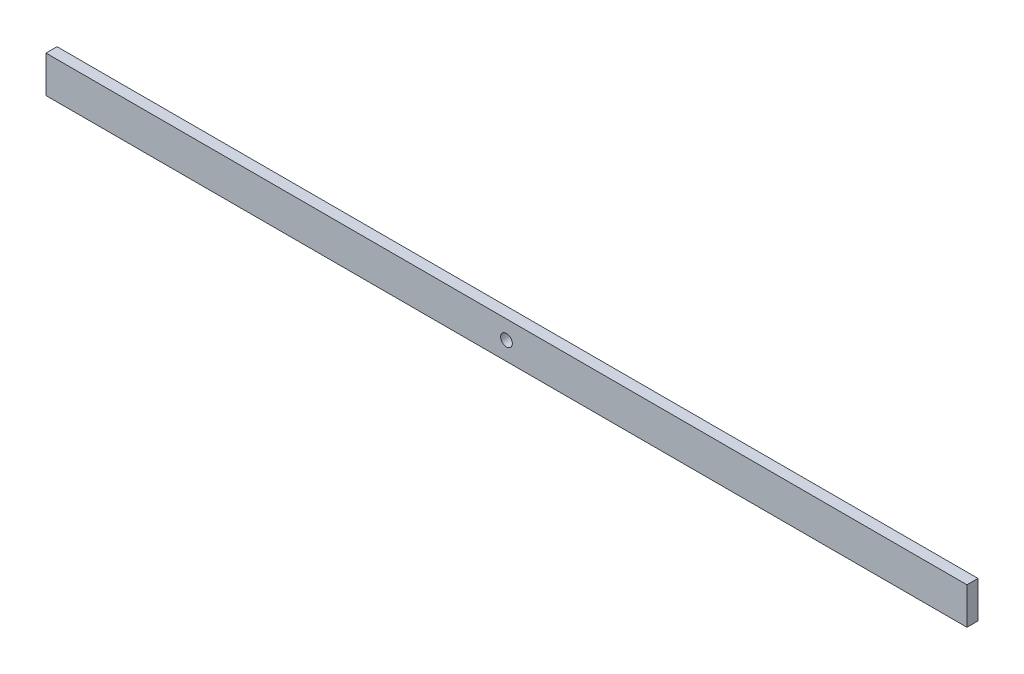
ISO-10303-21;
HEADER;
FILE_DESCRIPTION(('STEP AP214'),'2;1');
FILE_NAME('part.step','',(''),(''),'','','');
FILE_SCHEMA(('AUTOMOTIVE_DESIGN { 1 0 10303 214 1 1 1 1 }'));
ENDSEC;
DATA;
#1=APPLICATION_CONTEXT('core data for automotive mechanical design processes');
#2=APPLICATION_PROTOCOL_DEFINITION('international standard','automotive_design',2000,#1);
#3=PRODUCT_CONTEXT('',#1,'mechanical');
#4=PRODUCT('Part','Part','',(#3));
#5=PRODUCT_RELATED_PRODUCT_CATEGORY('part','',(#4));
#6=PRODUCT_DEFINITION_FORMATION('','',#4);
#7=PRODUCT_DEFINITION_CONTEXT('part definition',#1,'design');
#8=PRODUCT_DEFINITION('design','',#6,#7);
#9=PRODUCT_DEFINITION_SHAPE('','',#8);
#10=(LENGTH_UNIT() NAMED_UNIT(*) SI_UNIT(.MILLI.,.METRE.));
#11=(NAMED_UNIT(*) PLANE_ANGLE_UNIT() SI_UNIT($,.RADIAN.));
#12=(NAMED_UNIT(*) SI_UNIT($,.STERADIAN.) SOLID_ANGLE_UNIT());
#13=UNCERTAINTY_MEASURE_WITH_UNIT(LENGTH_MEASURE(1.E-05),#10,'distance_accuracy_value','');
#14=(GEOMETRIC_REPRESENTATION_CONTEXT(3) GLOBAL_UNCERTAINTY_ASSIGNED_CONTEXT((#13)) GLOBAL_UNIT_ASSIGNED_CONTEXT((#10,
#11,#12)) REPRESENTATION_CONTEXT('',''));
#15=CARTESIAN_POINT('',(0.,0.,0.));
#16=DIRECTION('',(0.,0.,1.));
#17=DIRECTION('',(1.,0.,0.));
#18=AXIS2_PLACEMENT_3D('',#15,#16,#17);
#19=CARTESIAN_POINT('',(0.,0.,3.));
#20=DIRECTION('',(0.,0.,1.));
#21=DIRECTION('',(1.,0.,0.));
#22=AXIS2_PLACEMENT_3D('',#19,#20,#21);
#23=PLANE('',#22);
#24=DIRECTION('',(0.,1.,0.));
#25=VECTOR('',#24,1.);
#26=CARTESIAN_POINT('',(125.,5.,3.));
#27=LINE('',#26,#25);
#28=CARTESIAN_POINT('',(125.,-5.,3.));
#29=VERTEX_POINT('',#28);
#30=CARTESIAN_POINT('',(125.,5.,3.));
#31=VERTEX_POINT('',#30);
#32=EDGE_CURVE('E85',#29,#31,#27,.T.);
#33=ORIENTED_EDGE('',*,*,#32,.T.);
#34=DIRECTION('',(-1.,0.,0.));
#35=VECTOR('',#34,1.);
#36=CARTESIAN_POINT('',(-125.,5.,3.));
#37=LINE('',#36,#35);
#38=CARTESIAN_POINT('',(-125.,5.,3.));
#39=VERTEX_POINT('',#38);
#40=EDGE_CURVE('E80',#31,#39,#37,.T.);
#41=ORIENTED_EDGE('',*,*,#40,.T.);
#42=DIRECTION('',(0.,-1.,0.));
#43=VECTOR('',#42,1.);
#44=CARTESIAN_POINT('',(-125.,5.,3.));
#45=LINE('',#44,#43);
#46=CARTESIAN_POINT('',(-125.,-5.,3.));
#47=VERTEX_POINT('',#46);
#48=EDGE_CURVE('E83',#39,#47,#45,.T.);
#49=ORIENTED_EDGE('',*,*,#48,.T.);
#50=DIRECTION('',(1.,0.,0.));
#51=VECTOR('',#50,1.);
#52=CARTESIAN_POINT('',(-125.,-5.,3.));
#53=LINE('',#52,#51);
#54=EDGE_CURVE('E50',#47,#29,#53,.T.);
#55=ORIENTED_EDGE('',*,*,#54,.T.);
#56=EDGE_LOOP('',(#33,#41,#49,#55));
#57=FACE_BOUND('',#56,.T.);
#58=CARTESIAN_POINT('',(0.,0.,3.));
#59=DIRECTION('',(0.,0.,1.));
#60=DIRECTION('',(1.,0.,0.));
#61=AXIS2_PLACEMENT_3D('',#58,#59,#60);
#62=CIRCLE('',#61,1.585);
#63=CARTESIAN_POINT('',(1.58499999999997,0.,3.));
#64=VERTEX_POINT('',#63);
#65=EDGE_CURVE('E100',#64,#64,#62,.T.);
#66=ORIENTED_EDGE('',*,*,#65,.F.);
#67=EDGE_LOOP('',(#66));
#68=FACE_BOUND('',#67,.T.);
#69=ADVANCED_FACE('F33',(#57,#68),#23,.T.);
#70=CARTESIAN_POINT('',(0.,0.,0.));
#71=DIRECTION('',(0.,0.,1.));
#72=DIRECTION('',(1.,0.,0.));
#73=AXIS2_PLACEMENT_3D('',#70,#71,#72);
#74=PLANE('',#73);
#75=DIRECTION('',(0.,1.,0.));
#76=VECTOR('',#75,1.);
#77=CARTESIAN_POINT('',(125.,5.,0.));
#78=LINE('',#77,#76);
#79=CARTESIAN_POINT('',(125.,-5.,0.));
#80=VERTEX_POINT('',#79);
#81=CARTESIAN_POINT('',(125.,5.,0.));
#82=VERTEX_POINT('',#81);
#83=EDGE_CURVE('E97',#80,#82,#78,.T.);
#84=ORIENTED_EDGE('',*,*,#83,.F.);
#85=DIRECTION('',(1.,0.,0.));
#86=VECTOR('',#85,1.);
#87=CARTESIAN_POINT('',(-125.,-5.,0.));
#88=LINE('',#87,#86);
#89=CARTESIAN_POINT('',(-125.,-5.,0.));
#90=VERTEX_POINT('',#89);
#91=EDGE_CURVE('E73',#90,#80,#88,.T.);
#92=ORIENTED_EDGE('',*,*,#91,.F.);
#93=DIRECTION('',(0.,-1.,0.));
#94=VECTOR('',#93,1.);
#95=CARTESIAN_POINT('',(-125.,5.,0.));
#96=LINE('',#95,#94);
#97=CARTESIAN_POINT('',(-125.,5.,0.));
#98=VERTEX_POINT('',#97);
#99=EDGE_CURVE('E67',#98,#90,#96,.T.);
#100=ORIENTED_EDGE('',*,*,#99,.F.);
#101=DIRECTION('',(-1.,0.,0.));
#102=VECTOR('',#101,1.);
#103=CARTESIAN_POINT('',(-125.,5.,0.));
#104=LINE('',#103,#102);
#105=EDGE_CURVE('E89',#82,#98,#104,.T.);
#106=ORIENTED_EDGE('',*,*,#105,.F.);
#107=EDGE_LOOP('',(#84,#92,#100,#106));
#108=FACE_BOUND('',#107,.T.);
#109=CARTESIAN_POINT('',(0.,0.,0.));
#110=DIRECTION('',(0.,0.,1.));
#111=DIRECTION('',(1.,0.,0.));
#112=AXIS2_PLACEMENT_3D('',#109,#110,#111);
#113=CIRCLE('',#112,1.585);
#114=CARTESIAN_POINT('',(1.58499999999997,0.,0.));
#115=VERTEX_POINT('',#114);
#116=EDGE_CURVE('E112',#115,#115,#113,.T.);
#117=ORIENTED_EDGE('',*,*,#116,.T.);
#118=EDGE_LOOP('',(#117));
#119=FACE_BOUND('',#118,.T.);
#120=ADVANCED_FACE('F108',(#108,#119),#74,.F.);
#121=CARTESIAN_POINT('',(125.,5.,3.));
#122=DIRECTION('',(-1.,0.,0.));
#123=DIRECTION('',(0.,0.,1.));
#124=AXIS2_PLACEMENT_3D('',#121,#122,#123);
#125=PLANE('',#124);
#126=ORIENTED_EDGE('',*,*,#83,.T.);
#127=DIRECTION('',(0.,0.,-1.));
#128=VECTOR('',#127,1.);
#129=CARTESIAN_POINT('',(125.,5.,3.));
#130=LINE('',#129,#128);
#131=EDGE_CURVE('E11',#31,#82,#130,.T.);
#132=ORIENTED_EDGE('',*,*,#131,.F.);
#133=ORIENTED_EDGE('',*,*,#32,.F.);
#134=DIRECTION('',(0.,0.,-1.));
#135=VECTOR('',#134,1.);
#136=CARTESIAN_POINT('',(125.,-5.,3.));
#137=LINE('',#136,#135);
#138=EDGE_CURVE('E93',#29,#80,#137,.T.);
#139=ORIENTED_EDGE('',*,*,#138,.T.);
#140=EDGE_LOOP('',(#126,#132,#133,#139));
#141=FACE_BOUND('',#140,.T.);
#142=ADVANCED_FACE('F35',(#141),#125,.F.);
#143=CARTESIAN_POINT('',(-125.,5.,3.));
#144=DIRECTION('',(0.,-1.,0.));
#145=DIRECTION('',(0.,0.,-1.));
#146=AXIS2_PLACEMENT_3D('',#143,#144,#145);
#147=PLANE('',#146);
#148=ORIENTED_EDGE('',*,*,#105,.T.);
#149=DIRECTION('',(0.,0.,-1.));
#150=VECTOR('',#149,1.);
#151=CARTESIAN_POINT('',(-125.,5.,3.));
#152=LINE('',#151,#150);
#153=EDGE_CURVE('E42',#39,#98,#152,.T.);
#154=ORIENTED_EDGE('',*,*,#153,.F.);
#155=ORIENTED_EDGE('',*,*,#40,.F.);
#156=ORIENTED_EDGE('',*,*,#131,.T.);
#157=EDGE_LOOP('',(#148,#154,#155,#156));
#158=FACE_BOUND('',#157,.T.);
#159=ADVANCED_FACE('F88',(#158),#147,.F.);
#160=CARTESIAN_POINT('',(-125.,5.,3.));
#161=DIRECTION('',(1.,0.,0.));
#162=DIRECTION('',(0.,0.,-1.));
#163=AXIS2_PLACEMENT_3D('',#160,#161,#162);
#164=PLANE('',#163);
#165=ORIENTED_EDGE('',*,*,#99,.T.);
#166=DIRECTION('',(0.,0.,-1.));
#167=VECTOR('',#166,1.);
#168=CARTESIAN_POINT('',(-125.,-5.,3.));
#169=LINE('',#168,#167);
#170=EDGE_CURVE('E90',#47,#90,#169,.T.);
#171=ORIENTED_EDGE('',*,*,#170,.F.);
#172=ORIENTED_EDGE('',*,*,#48,.F.);
#173=ORIENTED_EDGE('',*,*,#153,.T.);
#174=EDGE_LOOP('',(#165,#171,#172,#173));
#175=FACE_BOUND('',#174,.T.);
#176=ADVANCED_FACE('F91',(#175),#164,.F.);
#177=CARTESIAN_POINT('',(-125.,-5.,3.));
#178=DIRECTION('',(0.,1.,0.));
#179=DIRECTION('',(0.,0.,1.));
#180=AXIS2_PLACEMENT_3D('',#177,#178,#179);
#181=PLANE('',#180);
#182=ORIENTED_EDGE('',*,*,#91,.T.);
#183=ORIENTED_EDGE('',*,*,#138,.F.);
#184=ORIENTED_EDGE('',*,*,#54,.F.);
#185=ORIENTED_EDGE('',*,*,#170,.T.);
#186=EDGE_LOOP('',(#182,#183,#184,#185));
#187=FACE_BOUND('',#186,.T.);
#188=ADVANCED_FACE('F105',(#187),#181,.F.);
#189=CARTESIAN_POINT('',(0.,0.,3.));
#190=DIRECTION('',(0.,0.,-1.));
#191=DIRECTION('',(-1.,0.,0.));
#192=AXIS2_PLACEMENT_3D('',#189,#190,#191);
#193=CYLINDRICAL_SURFACE('',#192,1.585);
#194=ORIENTED_EDGE('',*,*,#65,.T.);
#195=EDGE_LOOP('',(#194));
#196=FACE_BOUND('',#195,.T.);
#197=ORIENTED_EDGE('',*,*,#116,.F.);
#198=EDGE_LOOP('',(#197));
#199=FACE_BOUND('',#198,.T.);
#200=ADVANCED_FACE('F118',(#196,#199),#193,.F.);
#201=CLOSED_SHELL('',(#69,#120,#142,#159,#176,#188,#200));
#202=MANIFOLD_SOLID_BREP('B2',#201);
#203=ADVANCED_BREP_SHAPE_REPRESENTATION('',(#18,#202),#14);
#204=SHAPE_DEFINITION_REPRESENTATION(#9,#203);
ENDSEC;
END-ISO-10303-21;
